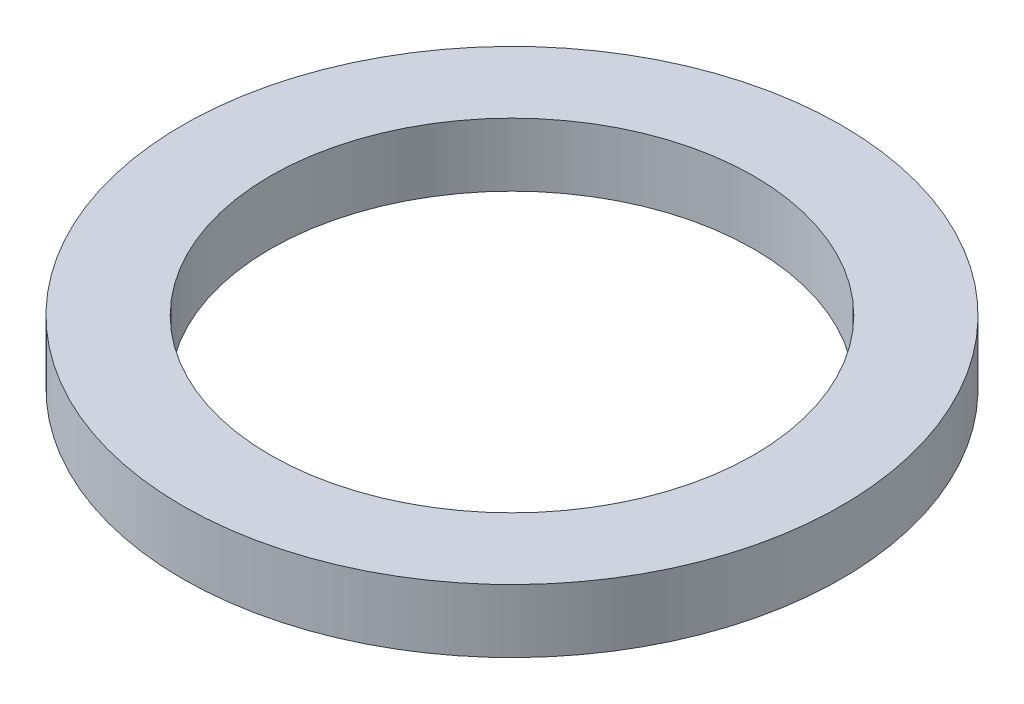
ISO-10303-21;
HEADER;
FILE_DESCRIPTION(('STEP AP214'),'2;1');
FILE_NAME('part.step','',(''),(''),'','','');
FILE_SCHEMA(('AUTOMOTIVE_DESIGN { 1 0 10303 214 1 1 1 1 }'));
ENDSEC;
DATA;
#1=APPLICATION_CONTEXT('core data for automotive mechanical design processes');
#2=APPLICATION_PROTOCOL_DEFINITION('international standard','automotive_design',2000,#1);
#3=PRODUCT_CONTEXT('',#1,'mechanical');
#4=PRODUCT('Part','Part','',(#3));
#5=PRODUCT_RELATED_PRODUCT_CATEGORY('part','',(#4));
#6=PRODUCT_DEFINITION_FORMATION('','',#4);
#7=PRODUCT_DEFINITION_CONTEXT('part definition',#1,'design');
#8=PRODUCT_DEFINITION('design','',#6,#7);
#9=PRODUCT_DEFINITION_SHAPE('','',#8);
#10=(LENGTH_UNIT() NAMED_UNIT(*) SI_UNIT(.MILLI.,.METRE.));
#11=(NAMED_UNIT(*) PLANE_ANGLE_UNIT() SI_UNIT($,.RADIAN.));
#12=(NAMED_UNIT(*) SI_UNIT($,.STERADIAN.) SOLID_ANGLE_UNIT());
#13=UNCERTAINTY_MEASURE_WITH_UNIT(LENGTH_MEASURE(1.E-05),#10,'distance_accuracy_value','');
#14=(GEOMETRIC_REPRESENTATION_CONTEXT(3) GLOBAL_UNCERTAINTY_ASSIGNED_CONTEXT((#13)) GLOBAL_UNIT_ASSIGNED_CONTEXT((#10,
#11,#12)) REPRESENTATION_CONTEXT('',''));
#15=CARTESIAN_POINT('',(0.,0.,0.));
#16=DIRECTION('',(0.,0.,1.));
#17=DIRECTION('',(1.,0.,0.));
#18=AXIS2_PLACEMENT_3D('',#15,#16,#17);
#19=CARTESIAN_POINT('',(0.,2.08,0.));
#20=DIRECTION('',(0.,-1.,0.));
#21=DIRECTION('',(0.,0.,-1.));
#22=AXIS2_PLACEMENT_3D('',#19,#20,#21);
#23=CYLINDRICAL_SURFACE('',#22,10.84);
#24=CARTESIAN_POINT('',(0.,2.08,0.));
#25=DIRECTION('',(0.,1.,0.));
#26=DIRECTION('',(0.,0.,1.));
#27=AXIS2_PLACEMENT_3D('',#24,#25,#26);
#28=CIRCLE('',#27,10.84);
#29=CARTESIAN_POINT('',(0.,2.08,10.84));
#30=VERTEX_POINT('',#29);
#31=EDGE_CURVE('E10',#30,#30,#28,.T.);
#32=ORIENTED_EDGE('',*,*,#31,.F.);
#33=EDGE_LOOP('',(#32));
#34=FACE_BOUND('',#33,.T.);
#35=CARTESIAN_POINT('',(0.,0.,0.));
#36=DIRECTION('',(0.,1.,0.));
#37=DIRECTION('',(0.,0.,1.));
#38=AXIS2_PLACEMENT_3D('',#35,#36,#37);
#39=CIRCLE('',#38,10.84);
#40=CARTESIAN_POINT('',(0.,0.,10.84));
#41=VERTEX_POINT('',#40);
#42=EDGE_CURVE('E37',#41,#41,#39,.T.);
#43=ORIENTED_EDGE('',*,*,#42,.T.);
#44=EDGE_LOOP('',(#43));
#45=FACE_BOUND('',#44,.T.);
#46=ADVANCED_FACE('F30',(#34,#45),#23,.T.);
#47=CARTESIAN_POINT('',(0.,2.08,0.));
#48=DIRECTION('',(0.,1.,0.));
#49=DIRECTION('',(0.,0.,1.));
#50=AXIS2_PLACEMENT_3D('',#47,#48,#49);
#51=PLANE('',#50);
#52=CARTESIAN_POINT('',(0.,2.08,0.));
#53=DIRECTION('',(0.,1.,0.));
#54=DIRECTION('',(0.,0.,1.));
#55=AXIS2_PLACEMENT_3D('',#52,#53,#54);
#56=CIRCLE('',#55,7.95);
#57=CARTESIAN_POINT('',(0.,2.08,7.95));
#58=VERTEX_POINT('',#57);
#59=EDGE_CURVE('E42',#58,#58,#56,.F.);
#60=ORIENTED_EDGE('',*,*,#59,.T.);
#61=EDGE_LOOP('',(#60));
#62=FACE_BOUND('',#61,.T.);
#63=ORIENTED_EDGE('',*,*,#31,.T.);
#64=EDGE_LOOP('',(#63));
#65=FACE_BOUND('',#64,.T.);
#66=ADVANCED_FACE('F55',(#62,#65),#51,.T.);
#67=CARTESIAN_POINT('',(0.,0.,0.));
#68=DIRECTION('',(0.,1.,0.));
#69=DIRECTION('',(0.,0.,1.));
#70=AXIS2_PLACEMENT_3D('',#67,#68,#69);
#71=PLANE('',#70);
#72=CARTESIAN_POINT('',(0.,0.,0.));
#73=DIRECTION('',(0.,1.,0.));
#74=DIRECTION('',(0.,0.,1.));
#75=AXIS2_PLACEMENT_3D('',#72,#73,#74);
#76=CIRCLE('',#75,7.95);
#77=CARTESIAN_POINT('',(0.,0.,7.95));
#78=VERTEX_POINT('',#77);
#79=EDGE_CURVE('E33',#78,#78,#76,.F.);
#80=ORIENTED_EDGE('',*,*,#79,.F.);
#81=EDGE_LOOP('',(#80));
#82=FACE_BOUND('',#81,.T.);
#83=ORIENTED_EDGE('',*,*,#42,.F.);
#84=EDGE_LOOP('',(#83));
#85=FACE_BOUND('',#84,.T.);
#86=ADVANCED_FACE('F52',(#82,#85),#71,.F.);
#87=CARTESIAN_POINT('',(0.,4.08,0.));
#88=DIRECTION('',(0.,-1.,0.));
#89=DIRECTION('',(0.,0.,-1.));
#90=AXIS2_PLACEMENT_3D('',#87,#88,#89);
#91=CYLINDRICAL_SURFACE('',#90,7.95);
#92=ORIENTED_EDGE('',*,*,#59,.F.);
#93=EDGE_LOOP('',(#92));
#94=FACE_BOUND('',#93,.T.);
#95=ORIENTED_EDGE('',*,*,#79,.T.);
#96=EDGE_LOOP('',(#95));
#97=FACE_BOUND('',#96,.T.);
#98=ADVANCED_FACE('F50',(#94,#97),#91,.F.);
#99=CLOSED_SHELL('',(#46,#66,#86,#98));
#100=MANIFOLD_SOLID_BREP('B2',#99);
#101=ADVANCED_BREP_SHAPE_REPRESENTATION('',(#18,#100),#14);
#102=SHAPE_DEFINITION_REPRESENTATION(#9,#101);
ENDSEC;
END-ISO-10303-21;
